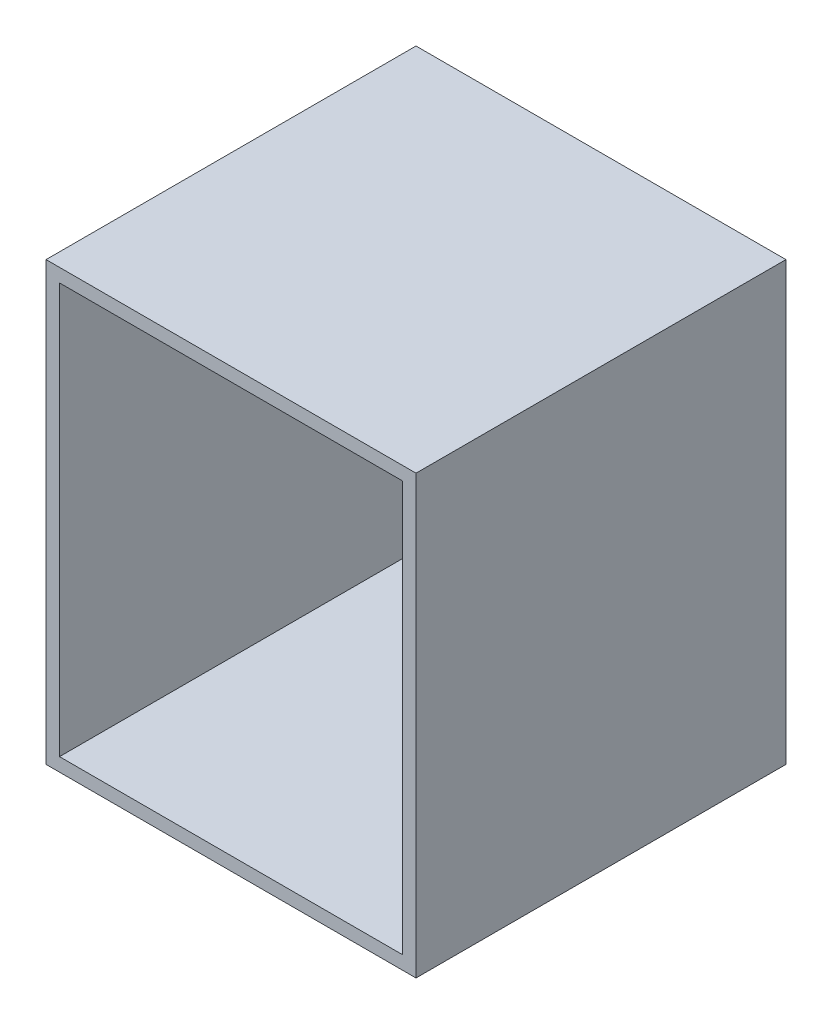
ISO-10303-21;
HEADER;
FILE_DESCRIPTION(('STEP AP214'),'2;1');
FILE_NAME('part.step','',(''),(''),'','','');
FILE_SCHEMA(('AUTOMOTIVE_DESIGN { 1 0 10303 214 1 1 1 1 }'));
ENDSEC;
DATA;
#1=APPLICATION_CONTEXT('core data for automotive mechanical design processes');
#2=APPLICATION_PROTOCOL_DEFINITION('international standard','automotive_design',2000,#1);
#3=PRODUCT_CONTEXT('',#1,'mechanical');
#4=PRODUCT('Part','Part','',(#3));
#5=PRODUCT_RELATED_PRODUCT_CATEGORY('part','',(#4));
#6=PRODUCT_DEFINITION_FORMATION('','',#4);
#7=PRODUCT_DEFINITION_CONTEXT('part definition',#1,'design');
#8=PRODUCT_DEFINITION('design','',#6,#7);
#9=PRODUCT_DEFINITION_SHAPE('','',#8);
#10=(LENGTH_UNIT() NAMED_UNIT(*) SI_UNIT(.MILLI.,.METRE.));
#11=(NAMED_UNIT(*) PLANE_ANGLE_UNIT() SI_UNIT($,.RADIAN.));
#12=(NAMED_UNIT(*) SI_UNIT($,.STERADIAN.) SOLID_ANGLE_UNIT());
#13=UNCERTAINTY_MEASURE_WITH_UNIT(LENGTH_MEASURE(1.E-05),#10,'distance_accuracy_value','');
#14=(GEOMETRIC_REPRESENTATION_CONTEXT(3) GLOBAL_UNCERTAINTY_ASSIGNED_CONTEXT((#13)) GLOBAL_UNIT_ASSIGNED_CONTEXT((#10,
#11,#12)) REPRESENTATION_CONTEXT('',''));
#15=CARTESIAN_POINT('',(0.,0.,0.));
#16=DIRECTION('',(0.,0.,1.));
#17=DIRECTION('',(1.,0.,0.));
#18=AXIS2_PLACEMENT_3D('',#15,#16,#17);
#19=CARTESIAN_POINT('',(-27.5,-32.5,27.5));
#20=DIRECTION('',(1.,0.,0.));
#21=DIRECTION('',(0.,0.,-1.));
#22=AXIS2_PLACEMENT_3D('',#19,#20,#21);
#23=PLANE('',#22);
#24=DIRECTION('',(0.,-1.,0.));
#25=VECTOR('',#24,1.);
#26=CARTESIAN_POINT('',(-27.5,-32.5,-27.5));
#27=LINE('',#26,#25);
#28=CARTESIAN_POINT('',(-27.5,32.5,-27.5));
#29=VERTEX_POINT('',#28);
#30=CARTESIAN_POINT('',(-27.5,-32.5,-27.5));
#31=VERTEX_POINT('',#30);
#32=EDGE_CURVE('E129',#29,#31,#27,.T.);
#33=ORIENTED_EDGE('',*,*,#32,.T.);
#34=DIRECTION('',(0.,0.,-1.));
#35=VECTOR('',#34,1.);
#36=CARTESIAN_POINT('',(-27.5,-32.5,27.5));
#37=LINE('',#36,#35);
#38=CARTESIAN_POINT('',(-27.5,-32.5,27.5));
#39=VERTEX_POINT('',#38);
#40=EDGE_CURVE('E11',#39,#31,#37,.T.);
#41=ORIENTED_EDGE('',*,*,#40,.F.);
#42=DIRECTION('',(0.,-1.,0.));
#43=VECTOR('',#42,1.);
#44=CARTESIAN_POINT('',(-27.5,-32.5,27.5));
#45=LINE('',#44,#43);
#46=CARTESIAN_POINT('',(-27.5,32.5,27.5));
#47=VERTEX_POINT('',#46);
#48=EDGE_CURVE('E138',#47,#39,#45,.T.);
#49=ORIENTED_EDGE('',*,*,#48,.F.);
#50=DIRECTION('',(0.,0.,-1.));
#51=VECTOR('',#50,1.);
#52=CARTESIAN_POINT('',(-27.5,32.5,27.5));
#53=LINE('',#52,#51);
#54=EDGE_CURVE('E148',#47,#29,#53,.T.);
#55=ORIENTED_EDGE('',*,*,#54,.T.);
#56=EDGE_LOOP('',(#33,#41,#49,#55));
#57=FACE_BOUND('',#56,.T.);
#58=ADVANCED_FACE('F39',(#57),#23,.F.);
#59=CARTESIAN_POINT('',(27.5,-32.5,27.5));
#60=DIRECTION('',(0.,1.,0.));
#61=DIRECTION('',(-1.,0.,0.));
#62=AXIS2_PLACEMENT_3D('',#59,#60,#61);
#63=PLANE('',#62);
#64=DIRECTION('',(1.,0.,0.));
#65=VECTOR('',#64,1.);
#66=CARTESIAN_POINT('',(27.5,-32.5,-27.5));
#67=LINE('',#66,#65);
#68=CARTESIAN_POINT('',(27.5,-32.5,-27.5));
#69=VERTEX_POINT('',#68);
#70=EDGE_CURVE('E151',#31,#69,#67,.T.);
#71=ORIENTED_EDGE('',*,*,#70,.T.);
#72=DIRECTION('',(0.,0.,-1.));
#73=VECTOR('',#72,1.);
#74=CARTESIAN_POINT('',(27.5,-32.5,27.5));
#75=LINE('',#74,#73);
#76=CARTESIAN_POINT('',(27.5,-32.5,27.5));
#77=VERTEX_POINT('',#76);
#78=EDGE_CURVE('E46',#77,#69,#75,.T.);
#79=ORIENTED_EDGE('',*,*,#78,.F.);
#80=DIRECTION('',(1.,0.,0.));
#81=VECTOR('',#80,1.);
#82=CARTESIAN_POINT('',(27.5,-32.5,27.5));
#83=LINE('',#82,#81);
#84=EDGE_CURVE('E141',#39,#77,#83,.T.);
#85=ORIENTED_EDGE('',*,*,#84,.F.);
#86=ORIENTED_EDGE('',*,*,#40,.T.);
#87=EDGE_LOOP('',(#71,#79,#85,#86));
#88=FACE_BOUND('',#87,.T.);
#89=ADVANCED_FACE('F179',(#88),#63,.F.);
#90=CARTESIAN_POINT('',(27.5,-32.5,27.5));
#91=DIRECTION('',(-1.,0.,0.));
#92=DIRECTION('',(0.,0.,1.));
#93=AXIS2_PLACEMENT_3D('',#90,#91,#92);
#94=PLANE('',#93);
#95=DIRECTION('',(0.,1.,0.));
#96=VECTOR('',#95,1.);
#97=CARTESIAN_POINT('',(27.5,-32.5,-27.5));
#98=LINE('',#97,#96);
#99=CARTESIAN_POINT('',(27.5,32.5,-27.5));
#100=VERTEX_POINT('',#99);
#101=EDGE_CURVE('E153',#69,#100,#98,.T.);
#102=ORIENTED_EDGE('',*,*,#101,.T.);
#103=DIRECTION('',(0.,0.,-1.));
#104=VECTOR('',#103,1.);
#105=CARTESIAN_POINT('',(27.5,32.5,27.5));
#106=LINE('',#105,#104);
#107=CARTESIAN_POINT('',(27.5,32.5,27.5));
#108=VERTEX_POINT('',#107);
#109=EDGE_CURVE('E158',#108,#100,#106,.T.);
#110=ORIENTED_EDGE('',*,*,#109,.F.);
#111=DIRECTION('',(0.,1.,0.));
#112=VECTOR('',#111,1.);
#113=CARTESIAN_POINT('',(27.5,-32.5,27.5));
#114=LINE('',#113,#112);
#115=EDGE_CURVE('E144',#77,#108,#114,.T.);
#116=ORIENTED_EDGE('',*,*,#115,.F.);
#117=ORIENTED_EDGE('',*,*,#78,.T.);
#118=EDGE_LOOP('',(#102,#110,#116,#117));
#119=FACE_BOUND('',#118,.T.);
#120=ADVANCED_FACE('F165',(#119),#94,.F.);
#121=CARTESIAN_POINT('',(27.5,32.5,27.5));
#122=DIRECTION('',(0.,-1.,0.));
#123=DIRECTION('',(0.,0.,-1.));
#124=AXIS2_PLACEMENT_3D('',#121,#122,#123);
#125=PLANE('',#124);
#126=DIRECTION('',(-1.,0.,0.));
#127=VECTOR('',#126,1.);
#128=CARTESIAN_POINT('',(27.5,32.5,-27.5));
#129=LINE('',#128,#127);
#130=EDGE_CURVE('E142',#100,#29,#129,.T.);
#131=ORIENTED_EDGE('',*,*,#130,.T.);
#132=ORIENTED_EDGE('',*,*,#54,.F.);
#133=DIRECTION('',(-1.,0.,0.));
#134=VECTOR('',#133,1.);
#135=CARTESIAN_POINT('',(27.5,32.5,27.5));
#136=LINE('',#135,#134);
#137=EDGE_CURVE('E146',#108,#47,#136,.T.);
#138=ORIENTED_EDGE('',*,*,#137,.F.);
#139=ORIENTED_EDGE('',*,*,#109,.T.);
#140=EDGE_LOOP('',(#131,#132,#138,#139));
#141=FACE_BOUND('',#140,.T.);
#142=ADVANCED_FACE('F172',(#141),#125,.F.);
#143=CARTESIAN_POINT('',(0.,0.,27.5));
#144=DIRECTION('',(0.,0.,1.));
#145=DIRECTION('',(1.,0.,0.));
#146=AXIS2_PLACEMENT_3D('',#143,#144,#145);
#147=PLANE('',#146);
#148=DIRECTION('',(0.,-1.,0.));
#149=VECTOR('',#148,1.);
#150=CARTESIAN_POINT('',(-25.5,-32.5,27.5));
#151=LINE('',#150,#149);
#152=CARTESIAN_POINT('',(-25.5,30.5,27.5));
#153=VERTEX_POINT('',#152);
#154=CARTESIAN_POINT('',(-25.5,-30.5,27.5));
#155=VERTEX_POINT('',#154);
#156=EDGE_CURVE('E126',#153,#155,#151,.T.);
#157=ORIENTED_EDGE('',*,*,#156,.F.);
#158=DIRECTION('',(-1.,0.,0.));
#159=VECTOR('',#158,1.);
#160=CARTESIAN_POINT('',(27.5,30.5,27.5));
#161=LINE('',#160,#159);
#162=CARTESIAN_POINT('',(25.5,30.5,27.5));
#163=VERTEX_POINT('',#162);
#164=EDGE_CURVE('E131',#163,#153,#161,.T.);
#165=ORIENTED_EDGE('',*,*,#164,.F.);
#166=DIRECTION('',(0.,1.,0.));
#167=VECTOR('',#166,1.);
#168=CARTESIAN_POINT('',(25.5,-32.5,27.5));
#169=LINE('',#168,#167);
#170=CARTESIAN_POINT('',(25.5,-30.5,27.5));
#171=VERTEX_POINT('',#170);
#172=EDGE_CURVE('E107',#171,#163,#169,.T.);
#173=ORIENTED_EDGE('',*,*,#172,.F.);
#174=DIRECTION('',(1.,0.,0.));
#175=VECTOR('',#174,1.);
#176=CARTESIAN_POINT('',(27.5,-30.5,27.5));
#177=LINE('',#176,#175);
#178=EDGE_CURVE('E134',#155,#171,#177,.T.);
#179=ORIENTED_EDGE('',*,*,#178,.F.);
#180=EDGE_LOOP('',(#157,#165,#173,#179));
#181=FACE_BOUND('',#180,.T.);
#182=ORIENTED_EDGE('',*,*,#48,.T.);
#183=ORIENTED_EDGE('',*,*,#84,.T.);
#184=ORIENTED_EDGE('',*,*,#115,.T.);
#185=ORIENTED_EDGE('',*,*,#137,.T.);
#186=EDGE_LOOP('',(#182,#183,#184,#185));
#187=FACE_BOUND('',#186,.T.);
#188=ADVANCED_FACE('F178',(#181,#187),#147,.T.);
#189=CARTESIAN_POINT('',(0.,0.,-27.5));
#190=DIRECTION('',(0.,0.,1.));
#191=DIRECTION('',(1.,0.,0.));
#192=AXIS2_PLACEMENT_3D('',#189,#190,#191);
#193=PLANE('',#192);
#194=DIRECTION('',(1.,0.,0.));
#195=VECTOR('',#194,1.);
#196=CARTESIAN_POINT('',(-25.5,-30.5,-27.5));
#197=LINE('',#196,#195);
#198=CARTESIAN_POINT('',(-25.5,-30.5,-27.5));
#199=VERTEX_POINT('',#198);
#200=CARTESIAN_POINT('',(25.5,-30.5,-27.5));
#201=VERTEX_POINT('',#200);
#202=EDGE_CURVE('E121',#199,#201,#197,.T.);
#203=ORIENTED_EDGE('',*,*,#202,.T.);
#204=DIRECTION('',(0.,1.,0.));
#205=VECTOR('',#204,1.);
#206=CARTESIAN_POINT('',(25.5,-30.5,-27.5));
#207=LINE('',#206,#205);
#208=CARTESIAN_POINT('',(25.5,30.5,-27.5));
#209=VERTEX_POINT('',#208);
#210=EDGE_CURVE('E104',#201,#209,#207,.T.);
#211=ORIENTED_EDGE('',*,*,#210,.T.);
#212=DIRECTION('',(-1.,0.,0.));
#213=VECTOR('',#212,1.);
#214=CARTESIAN_POINT('',(25.5,30.5,-27.5));
#215=LINE('',#214,#213);
#216=CARTESIAN_POINT('',(-25.5,30.5,-27.5));
#217=VERTEX_POINT('',#216);
#218=EDGE_CURVE('E112',#209,#217,#215,.T.);
#219=ORIENTED_EDGE('',*,*,#218,.T.);
#220=DIRECTION('',(0.,-1.,0.));
#221=VECTOR('',#220,1.);
#222=CARTESIAN_POINT('',(-25.5,30.5,-27.5));
#223=LINE('',#222,#221);
#224=EDGE_CURVE('E116',#217,#199,#223,.T.);
#225=ORIENTED_EDGE('',*,*,#224,.T.);
#226=EDGE_LOOP('',(#203,#211,#219,#225));
#227=FACE_BOUND('',#226,.T.);
#228=ORIENTED_EDGE('',*,*,#32,.F.);
#229=ORIENTED_EDGE('',*,*,#130,.F.);
#230=ORIENTED_EDGE('',*,*,#101,.F.);
#231=ORIENTED_EDGE('',*,*,#70,.F.);
#232=EDGE_LOOP('',(#228,#229,#230,#231));
#233=FACE_BOUND('',#232,.T.);
#234=ADVANCED_FACE('F118',(#227,#233),#193,.F.);
#235=CARTESIAN_POINT('',(-25.5,-32.5,27.5));
#236=DIRECTION('',(1.,0.,0.));
#237=DIRECTION('',(0.,0.,-1.));
#238=AXIS2_PLACEMENT_3D('',#235,#236,#237);
#239=PLANE('',#238);
#240=DIRECTION('',(0.,0.,-1.));
#241=VECTOR('',#240,1.);
#242=CARTESIAN_POINT('',(-25.5,-30.5,27.5));
#243=LINE('',#242,#241);
#244=EDGE_CURVE('E127',#155,#199,#243,.T.);
#245=ORIENTED_EDGE('',*,*,#244,.T.);
#246=ORIENTED_EDGE('',*,*,#224,.F.);
#247=DIRECTION('',(0.,0.,-1.));
#248=VECTOR('',#247,1.);
#249=CARTESIAN_POINT('',(-25.5,30.5,27.5));
#250=LINE('',#249,#248);
#251=EDGE_CURVE('E53',#153,#217,#250,.T.);
#252=ORIENTED_EDGE('',*,*,#251,.F.);
#253=ORIENTED_EDGE('',*,*,#156,.T.);
#254=EDGE_LOOP('',(#245,#246,#252,#253));
#255=FACE_BOUND('',#254,.T.);
#256=ADVANCED_FACE('F191',(#255),#239,.T.);
#257=CARTESIAN_POINT('',(27.5,-30.5,27.5));
#258=DIRECTION('',(0.,1.,0.));
#259=DIRECTION('',(-1.,0.,0.));
#260=AXIS2_PLACEMENT_3D('',#257,#258,#259);
#261=PLANE('',#260);
#262=DIRECTION('',(0.,0.,-1.));
#263=VECTOR('',#262,1.);
#264=CARTESIAN_POINT('',(25.5,-30.5,27.5));
#265=LINE('',#264,#263);
#266=EDGE_CURVE('E109',#171,#201,#265,.T.);
#267=ORIENTED_EDGE('',*,*,#266,.T.);
#268=ORIENTED_EDGE('',*,*,#202,.F.);
#269=ORIENTED_EDGE('',*,*,#244,.F.);
#270=ORIENTED_EDGE('',*,*,#178,.T.);
#271=EDGE_LOOP('',(#267,#268,#269,#270));
#272=FACE_BOUND('',#271,.T.);
#273=ADVANCED_FACE('F199',(#272),#261,.T.);
#274=CARTESIAN_POINT('',(25.5,-32.5,27.5));
#275=DIRECTION('',(-1.,0.,0.));
#276=DIRECTION('',(0.,0.,1.));
#277=AXIS2_PLACEMENT_3D('',#274,#275,#276);
#278=PLANE('',#277);
#279=DIRECTION('',(0.,0.,-1.));
#280=VECTOR('',#279,1.);
#281=CARTESIAN_POINT('',(25.5,30.5,27.5));
#282=LINE('',#281,#280);
#283=EDGE_CURVE('E58',#163,#209,#282,.T.);
#284=ORIENTED_EDGE('',*,*,#283,.T.);
#285=ORIENTED_EDGE('',*,*,#210,.F.);
#286=ORIENTED_EDGE('',*,*,#266,.F.);
#287=ORIENTED_EDGE('',*,*,#172,.T.);
#288=EDGE_LOOP('',(#284,#285,#286,#287));
#289=FACE_BOUND('',#288,.T.);
#290=ADVANCED_FACE('F101',(#289),#278,.T.);
#291=CARTESIAN_POINT('',(27.5,30.5,27.5));
#292=DIRECTION('',(0.,-1.,0.));
#293=DIRECTION('',(0.,0.,-1.));
#294=AXIS2_PLACEMENT_3D('',#291,#292,#293);
#295=PLANE('',#294);
#296=ORIENTED_EDGE('',*,*,#251,.T.);
#297=ORIENTED_EDGE('',*,*,#218,.F.);
#298=ORIENTED_EDGE('',*,*,#283,.F.);
#299=ORIENTED_EDGE('',*,*,#164,.T.);
#300=EDGE_LOOP('',(#296,#297,#298,#299));
#301=FACE_BOUND('',#300,.T.);
#302=ADVANCED_FACE('F113',(#301),#295,.T.);
#303=CLOSED_SHELL('',(#58,#89,#120,#142,#188,#234,#256,#273,#290,#302));
#304=MANIFOLD_SOLID_BREP('B2',#303);
#305=ADVANCED_BREP_SHAPE_REPRESENTATION('',(#18,#304),#14);
#306=SHAPE_DEFINITION_REPRESENTATION(#9,#305);
ENDSEC;
END-ISO-10303-21;
